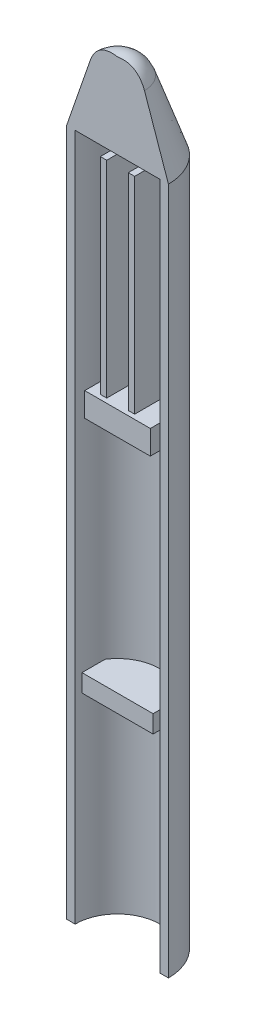
ISO-10303-21;
HEADER;
FILE_DESCRIPTION(('STEP AP214'),'2;1');
FILE_NAME('part.step','',(''),(''),'','','');
FILE_SCHEMA(('AUTOMOTIVE_DESIGN { 1 0 10303 214 1 1 1 1 }'));
ENDSEC;
DATA;
#1=APPLICATION_CONTEXT('core data for automotive mechanical design processes');
#2=APPLICATION_PROTOCOL_DEFINITION('international standard','automotive_design',2000,#1);
#3=PRODUCT_CONTEXT('',#1,'mechanical');
#4=PRODUCT('Part','Part','',(#3));
#5=PRODUCT_RELATED_PRODUCT_CATEGORY('part','',(#4));
#6=PRODUCT_DEFINITION_FORMATION('','',#4);
#7=PRODUCT_DEFINITION_CONTEXT('part definition',#1,'design');
#8=PRODUCT_DEFINITION('design','',#6,#7);
#9=PRODUCT_DEFINITION_SHAPE('','',#8);
#10=(LENGTH_UNIT() NAMED_UNIT(*) SI_UNIT(.MILLI.,.METRE.));
#11=(NAMED_UNIT(*) PLANE_ANGLE_UNIT() SI_UNIT($,.RADIAN.));
#12=(NAMED_UNIT(*) SI_UNIT($,.STERADIAN.) SOLID_ANGLE_UNIT());
#13=UNCERTAINTY_MEASURE_WITH_UNIT(LENGTH_MEASURE(1.E-05),#10,'distance_accuracy_value','');
#14=(GEOMETRIC_REPRESENTATION_CONTEXT(3) GLOBAL_UNCERTAINTY_ASSIGNED_CONTEXT((#13)) GLOBAL_UNIT_ASSIGNED_CONTEXT((#10,
#11,#12)) REPRESENTATION_CONTEXT('',''));
#15=CARTESIAN_POINT('',(0.,0.,0.));
#16=DIRECTION('',(0.,0.,1.));
#17=DIRECTION('',(1.,0.,0.));
#18=AXIS2_PLACEMENT_3D('',#15,#16,#17);
#19=CARTESIAN_POINT('',(0.,91.,0.));
#20=DIRECTION('',(0.,1.,0.));
#21=DIRECTION('',(-1.,0.,0.));
#22=AXIS2_PLACEMENT_3D('',#19,#20,#21);
#23=CYLINDRICAL_SURFACE('',#22,10.);
#24=DIRECTION('',(0.,1.,0.));
#25=VECTOR('',#24,1.);
#26=CARTESIAN_POINT('',(-4.03999999999998,91.,-9.14758984651152));
#27=LINE('',#26,#25);
#28=CARTESIAN_POINT('',(-4.03999999999997,20.0675731061453,-9.14758984651152));
#29=VERTEX_POINT('',#28);
#30=CARTESIAN_POINT('',(-4.03999999999998,68.6220349905325,-9.14758984651151));
#31=VERTEX_POINT('',#30);
#32=EDGE_CURVE('E360',#29,#31,#27,.T.);
#33=ORIENTED_EDGE('',*,*,#32,.T.);
#34=CARTESIAN_POINT('',(0.,68.6220349905325,0.));
#35=DIRECTION('',(0.,1.,0.));
#36=DIRECTION('',(0.,0.,1.));
#37=AXIS2_PLACEMENT_3D('',#34,#35,#36);
#38=CIRCLE('',#37,10.);
#39=CARTESIAN_POINT('',(4.03999999999998,68.6220349905325,-9.1475898465115));
#40=VERTEX_POINT('',#39);
#41=EDGE_CURVE('E330',#40,#31,#38,.T.);
#42=ORIENTED_EDGE('',*,*,#41,.F.);
#43=DIRECTION('',(0.,1.,0.));
#44=VECTOR('',#43,1.);
#45=CARTESIAN_POINT('',(4.03999999999998,91.,-9.14758984651149));
#46=LINE('',#45,#44);
#47=CARTESIAN_POINT('',(4.03999999999998,20.0675731061453,-9.14758984651149));
#48=VERTEX_POINT('',#47);
#49=EDGE_CURVE('E323',#48,#40,#46,.T.);
#50=ORIENTED_EDGE('',*,*,#49,.F.);
#51=CARTESIAN_POINT('',(0.,20.0675731061453,0.));
#52=DIRECTION('',(0.,1.,0.));
#53=DIRECTION('',(0.,0.,1.));
#54=AXIS2_PLACEMENT_3D('',#51,#52,#53);
#55=CIRCLE('',#54,10.);
#56=EDGE_CURVE('E317',#48,#29,#55,.T.);
#57=ORIENTED_EDGE('',*,*,#56,.T.);
#58=EDGE_LOOP('',(#33,#42,#50,#57));
#59=FACE_BOUND('',#58,.T.);
#60=CARTESIAN_POINT('',(0.,13.3474054598744,0.));
#61=DIRECTION('',(0.,-1.,0.));
#62=DIRECTION('',(1.,0.,0.));
#63=AXIS2_PLACEMENT_3D('',#60,#61,#62);
#64=CIRCLE('',#63,10.);
#65=CARTESIAN_POINT('',(-7.72890663595342,13.3474054598744,-6.3453922032224));
#66=VERTEX_POINT('',#65);
#67=CARTESIAN_POINT('',(7.72890663595337,13.3474054598744,-6.34539220322244));
#68=VERTEX_POINT('',#67);
#69=EDGE_CURVE('E280',#66,#68,#64,.T.);
#70=ORIENTED_EDGE('',*,*,#69,.F.);
#71=DIRECTION('',(0.,1.,0.));
#72=VECTOR('',#71,1.);
#73=CARTESIAN_POINT('',(-7.72890663595342,91.,-6.34539220322241));
#74=LINE('',#73,#72);
#75=CARTESIAN_POINT('',(-7.72890663595342,19.,-6.34539220322241));
#76=VERTEX_POINT('',#75);
#77=EDGE_CURVE('E277',#66,#76,#74,.T.);
#78=ORIENTED_EDGE('',*,*,#77,.T.);
#79=CARTESIAN_POINT('',(0.,19.,0.));
#80=DIRECTION('',(0.,-1.,0.));
#81=DIRECTION('',(1.,0.,0.));
#82=AXIS2_PLACEMENT_3D('',#79,#80,#81);
#83=CIRCLE('',#82,10.);
#84=CARTESIAN_POINT('',(7.72890663595337,19.,-6.34539220322242));
#85=VERTEX_POINT('',#84);
#86=EDGE_CURVE('E278',#76,#85,#83,.T.);
#87=ORIENTED_EDGE('',*,*,#86,.T.);
#88=DIRECTION('',(0.,1.,0.));
#89=VECTOR('',#88,1.);
#90=CARTESIAN_POINT('',(7.72890663595335,91.,-6.34539220322244));
#91=LINE('',#90,#89);
#92=EDGE_CURVE('E283',#68,#85,#91,.T.);
#93=ORIENTED_EDGE('',*,*,#92,.F.);
#94=EDGE_LOOP('',(#70,#78,#87,#93));
#95=FACE_BOUND('',#94,.T.);
#96=CARTESIAN_POINT('',(0.,-43.0528382170722,0.));
#97=DIRECTION('',(0.,-1.,0.));
#98=DIRECTION('',(0.,0.,-1.));
#99=AXIS2_PLACEMENT_3D('',#96,#97,#98);
#100=CIRCLE('',#99,10.);
#101=CARTESIAN_POINT('',(-8.38159543616838,-43.0528382170722,-5.45425136424804));
#102=VERTEX_POINT('',#101);
#103=CARTESIAN_POINT('',(8.38159543616822,-43.0528382170722,-5.45425136424825));
#104=VERTEX_POINT('',#103);
#105=EDGE_CURVE('E358',#102,#104,#100,.T.);
#106=ORIENTED_EDGE('',*,*,#105,.F.);
#107=DIRECTION('',(0.,1.,0.));
#108=VECTOR('',#107,1.);
#109=CARTESIAN_POINT('',(-8.38159543616838,91.,-5.45425136424807));
#110=LINE('',#109,#108);
#111=CARTESIAN_POINT('',(-8.38159543616838,-38.8960097043656,-5.45425136424807));
#112=VERTEX_POINT('',#111);
#113=EDGE_CURVE('E318',#102,#112,#110,.T.);
#114=ORIENTED_EDGE('',*,*,#113,.T.);
#115=CARTESIAN_POINT('',(0.,-38.8960097043655,0.));
#116=DIRECTION('',(0.,-1.,0.));
#117=DIRECTION('',(0.,0.,-1.));
#118=AXIS2_PLACEMENT_3D('',#115,#116,#117);
#119=CIRCLE('',#118,10.);
#120=CARTESIAN_POINT('',(8.38159543616822,-38.8960097043655,-5.45425136424827));
#121=VERTEX_POINT('',#120);
#122=EDGE_CURVE('E362',#112,#121,#119,.T.);
#123=ORIENTED_EDGE('',*,*,#122,.T.);
#124=DIRECTION('',(0.,1.,0.));
#125=VECTOR('',#124,1.);
#126=CARTESIAN_POINT('',(8.38159543616822,91.,-5.45425136424825));
#127=LINE('',#126,#125);
#128=EDGE_CURVE('E361',#104,#121,#127,.T.);
#129=ORIENTED_EDGE('',*,*,#128,.F.);
#130=EDGE_LOOP('',(#106,#114,#123,#129));
#131=FACE_BOUND('',#130,.T.);
#132=DIRECTION('',(0.,1.,0.));
#133=VECTOR('',#132,1.);
#134=CARTESIAN_POINT('',(9.99999999999999,91.,0.));
#135=LINE('',#134,#133);
#136=CARTESIAN_POINT('',(9.99999999999999,71.,0.));
#137=VERTEX_POINT('',#136);
#138=CARTESIAN_POINT('',(10.,-91.0399288571137,0.));
#139=VERTEX_POINT('',#138);
#140=EDGE_CURVE('E192',#137,#139,#135,.F.);
#141=ORIENTED_EDGE('',*,*,#140,.F.);
#142=CARTESIAN_POINT('',(0.,71.,0.));
#143=DIRECTION('',(0.,1.,0.));
#144=DIRECTION('',(-1.,0.,0.));
#145=AXIS2_PLACEMENT_3D('',#142,#143,#144);
#146=CIRCLE('',#145,10.);
#147=CARTESIAN_POINT('',(-10.,71.,0.));
#148=VERTEX_POINT('',#147);
#149=EDGE_CURVE('E11',#137,#148,#146,.T.);
#150=ORIENTED_EDGE('',*,*,#149,.T.);
#151=DIRECTION('',(0.,1.,0.));
#152=VECTOR('',#151,1.);
#153=CARTESIAN_POINT('',(-10.,91.,0.));
#154=LINE('',#153,#152);
#155=CARTESIAN_POINT('',(-10.,-91.0399288571137,0.));
#156=VERTEX_POINT('',#155);
#157=EDGE_CURVE('E64',#156,#148,#154,.T.);
#158=ORIENTED_EDGE('',*,*,#157,.F.);
#159=CARTESIAN_POINT('',(0.,-91.0399288571137,0.));
#160=DIRECTION('',(0.,1.,0.));
#161=DIRECTION('',(-1.,0.,0.));
#162=AXIS2_PLACEMENT_3D('',#159,#160,#161);
#163=CIRCLE('',#162,10.);
#164=EDGE_CURVE('E204',#139,#156,#163,.T.);
#165=ORIENTED_EDGE('',*,*,#164,.F.);
#166=EDGE_LOOP('',(#141,#150,#158,#165));
#167=FACE_BOUND('',#166,.T.);
#168=ADVANCED_FACE('F50',(#59,#95,#131,#167),#23,.F.);
#169=CARTESIAN_POINT('',(6.354000148981,87.2790396922268,0.));
#170=CARTESIAN_POINT('',(4.66858918472638,91.7236423414879,0.));
#171=CARTESIAN_POINT('',(0.,91.,0.));
#172=B_SPLINE_CURVE_WITH_KNOTS('',2,(#169,#170,#171),.UNSPECIFIED.,.F.,.F.,(3,3),(0.,1.),.UNSPECIFIED.);
#173=CARTESIAN_POINT('',(0.,91.,0.));
#174=DIRECTION('',(0.,1.,0.));
#175=AXIS1_PLACEMENT('',#173,#174);
#176=SURFACE_OF_REVOLUTION('',#172,#175);
#177=CARTESIAN_POINT('',(6.354000148981,87.2790396922268,0.));
#178=CARTESIAN_POINT('',(4.66858918472638,91.7236423414879,0.));
#179=CARTESIAN_POINT('',(0.,91.,0.));
#180=B_SPLINE_CURVE_WITH_KNOTS('',2,(#177,#178,#179),.UNSPECIFIED.,.F.,.F.,(3,3),(0.,1.),.UNSPECIFIED.);
#181=CARTESIAN_POINT('',(6.354000148981,87.2790396922268,0.));
#182=VERTEX_POINT('',#181);
#183=CARTESIAN_POINT('',(0.,91.,0.));
#184=VERTEX_POINT('',#183);
#185=EDGE_CURVE('E259',#182,#184,#180,.T.);
#186=ORIENTED_EDGE('',*,*,#185,.F.);
#187=CARTESIAN_POINT('',(0.,87.2790396922268,0.));
#188=DIRECTION('',(0.,1.,0.));
#189=DIRECTION('',(-1.,0.,0.));
#190=AXIS2_PLACEMENT_3D('',#187,#188,#189);
#191=CIRCLE('',#190,6.35400014898102);
#192=CARTESIAN_POINT('',(-6.35400014898104,87.2790396922268,0.));
#193=VERTEX_POINT('',#192);
#194=EDGE_CURVE('E60',#182,#193,#191,.T.);
#195=ORIENTED_EDGE('',*,*,#194,.T.);
#196=CARTESIAN_POINT('',(-6.35400014898105,87.2790396922268,0.));
#197=CARTESIAN_POINT('',(-4.66858918472643,91.7236423414879,0.));
#198=CARTESIAN_POINT('',(0.,91.,0.));
#199=B_SPLINE_CURVE_WITH_KNOTS('',2,(#196,#197,#198),.UNSPECIFIED.,.F.,.F.,(3,3),(0.,1.),.UNSPECIFIED.);
#200=EDGE_CURVE('E255',#184,#193,#199,.F.);
#201=ORIENTED_EDGE('',*,*,#200,.F.);
#202=EDGE_LOOP('',(#186,#195,#201));
#203=FACE_BOUND('',#202,.T.);
#204=ADVANCED_FACE('F47',(#203),#176,.T.);
#205=CARTESIAN_POINT('',(0.,71.,0.));
#206=DIRECTION('',(0.,-1.,0.));
#207=DIRECTION('',(1.,0.,0.));
#208=AXIS2_PLACEMENT_3D('',#205,#206,#207);
#209=CONICAL_SURFACE('',#208,12.,0.333844717599232);
#210=DIRECTION('',(-0.327677890106413,-0.944789500542533,0.));
#211=VECTOR('',#210,1.);
#212=CARTESIAN_POINT('',(0.,105.599447655222,0.));
#213=LINE('',#212,#211);
#214=CARTESIAN_POINT('',(-12.,71.,0.));
#215=VERTEX_POINT('',#214);
#216=EDGE_CURVE('E246',#193,#215,#213,.T.);
#217=ORIENTED_EDGE('',*,*,#216,.F.);
#218=ORIENTED_EDGE('',*,*,#194,.F.);
#219=DIRECTION('',(-0.327677890106413,0.944789500542533,0.));
#220=VECTOR('',#219,1.);
#221=CARTESIAN_POINT('',(0.,105.599447655222,0.));
#222=LINE('',#221,#220);
#223=CARTESIAN_POINT('',(12.,71.,0.));
#224=VERTEX_POINT('',#223);
#225=EDGE_CURVE('E254',#224,#182,#222,.T.);
#226=ORIENTED_EDGE('',*,*,#225,.F.);
#227=CARTESIAN_POINT('',(0.,71.,0.));
#228=DIRECTION('',(0.,1.,0.));
#229=DIRECTION('',(-1.,0.,0.));
#230=AXIS2_PLACEMENT_3D('',#227,#228,#229);
#231=CIRCLE('',#230,12.);
#232=EDGE_CURVE('E253',#224,#215,#231,.T.);
#233=ORIENTED_EDGE('',*,*,#232,.T.);
#234=EDGE_LOOP('',(#217,#218,#226,#233));
#235=FACE_BOUND('',#234,.T.);
#236=ADVANCED_FACE('F227',(#235),#209,.T.);
#237=CARTESIAN_POINT('',(0.,91.,0.));
#238=DIRECTION('',(0.,1.,0.));
#239=DIRECTION('',(-1.,0.,0.));
#240=AXIS2_PLACEMENT_3D('',#237,#238,#239);
#241=CYLINDRICAL_SURFACE('',#240,12.);
#242=DIRECTION('',(0.,1.,0.));
#243=VECTOR('',#242,1.);
#244=CARTESIAN_POINT('',(12.,91.,0.));
#245=LINE('',#244,#243);
#246=CARTESIAN_POINT('',(12.,-91.0399288571137,0.));
#247=VERTEX_POINT('',#246);
#248=EDGE_CURVE('E459',#247,#224,#245,.T.);
#249=ORIENTED_EDGE('',*,*,#248,.F.);
#250=CARTESIAN_POINT('',(0.,-91.0399288571137,0.));
#251=DIRECTION('',(0.,1.,0.));
#252=DIRECTION('',(-1.,0.,0.));
#253=AXIS2_PLACEMENT_3D('',#250,#251,#252);
#254=CIRCLE('',#253,12.);
#255=CARTESIAN_POINT('',(-12.,-91.0399288571137,0.));
#256=VERTEX_POINT('',#255);
#257=EDGE_CURVE('E265',#247,#256,#254,.T.);
#258=ORIENTED_EDGE('',*,*,#257,.T.);
#259=DIRECTION('',(0.,1.,0.));
#260=VECTOR('',#259,1.);
#261=CARTESIAN_POINT('',(-12.,91.,0.));
#262=LINE('',#261,#260);
#263=EDGE_CURVE('E465',#215,#256,#262,.F.);
#264=ORIENTED_EDGE('',*,*,#263,.F.);
#265=ORIENTED_EDGE('',*,*,#232,.F.);
#266=EDGE_LOOP('',(#249,#258,#264,#265));
#267=FACE_BOUND('',#266,.T.);
#268=ADVANCED_FACE('F218',(#267),#241,.T.);
#269=CARTESIAN_POINT('',(12.,-91.0399288571137,0.));
#270=DIRECTION('',(0.,1.,0.));
#271=DIRECTION('',(-1.,0.,0.));
#272=AXIS2_PLACEMENT_3D('',#269,#270,#271);
#273=PLANE('',#272);
#274=DIRECTION('',(1.,0.,0.));
#275=VECTOR('',#274,1.);
#276=CARTESIAN_POINT('',(12.,-91.0399288571137,0.));
#277=LINE('',#276,#275);
#278=EDGE_CURVE('E462',#256,#156,#277,.T.);
#279=ORIENTED_EDGE('',*,*,#278,.F.);
#280=ORIENTED_EDGE('',*,*,#257,.F.);
#281=EDGE_CURVE('E206',#139,#247,#277,.T.);
#282=ORIENTED_EDGE('',*,*,#281,.F.);
#283=ORIENTED_EDGE('',*,*,#164,.T.);
#284=EDGE_LOOP('',(#279,#280,#282,#283));
#285=FACE_BOUND('',#284,.T.);
#286=ADVANCED_FACE('F211',(#285),#273,.F.);
#287=CARTESIAN_POINT('',(12.,71.,0.));
#288=DIRECTION('',(0.,1.,0.));
#289=DIRECTION('',(-1.,0.,0.));
#290=AXIS2_PLACEMENT_3D('',#287,#288,#289);
#291=PLANE('',#290);
#292=DIRECTION('',(1.,0.,0.));
#293=VECTOR('',#292,1.);
#294=CARTESIAN_POINT('',(12.,71.,0.));
#295=LINE('',#294,#293);
#296=EDGE_CURVE('E191',#148,#137,#295,.T.);
#297=ORIENTED_EDGE('',*,*,#296,.F.);
#298=ORIENTED_EDGE('',*,*,#149,.F.);
#299=EDGE_LOOP('',(#297,#298));
#300=FACE_BOUND('',#299,.T.);
#301=ADVANCED_FACE('F208',(#300),#291,.F.);
#302=CARTESIAN_POINT('',(-2.53999999999998,0.,-12.002));
#303=DIRECTION('',(1.,0.,0.));
#304=DIRECTION('',(0.,0.,-1.));
#305=AXIS2_PLACEMENT_3D('',#302,#303,#304);
#306=PLANE('',#305);
#307=DIRECTION('',(0.,0.,1.));
#308=VECTOR('',#307,1.);
#309=CARTESIAN_POINT('',(-2.53999999999998,20.0675731061453,-12.002));
#310=LINE('',#309,#308);
#311=CARTESIAN_POINT('',(-2.53999999999998,20.0675731061453,-9.5));
#312=VERTEX_POINT('',#311);
#313=CARTESIAN_POINT('',(-2.53999999999998,20.0675731061453,0.));
#314=VERTEX_POINT('',#313);
#315=EDGE_CURVE('E75',#312,#314,#310,.T.);
#316=ORIENTED_EDGE('',*,*,#315,.F.);
#317=DIRECTION('',(0.,1.,0.));
#318=VECTOR('',#317,1.);
#319=CARTESIAN_POINT('',(-2.53999999999998,0.,-9.5));
#320=LINE('',#319,#318);
#321=CARTESIAN_POINT('',(-2.53999999999998,68.6220349905325,-9.5));
#322=VERTEX_POINT('',#321);
#323=EDGE_CURVE('E428',#312,#322,#320,.T.);
#324=ORIENTED_EDGE('',*,*,#323,.T.);
#325=DIRECTION('',(0.,0.,1.));
#326=VECTOR('',#325,1.);
#327=CARTESIAN_POINT('',(-2.53999999999998,68.6220349905325,-12.002));
#328=LINE('',#327,#326);
#329=CARTESIAN_POINT('',(-2.53999999999998,68.6220349905325,0.));
#330=VERTEX_POINT('',#329);
#331=EDGE_CURVE('E408',#322,#330,#328,.T.);
#332=ORIENTED_EDGE('',*,*,#331,.T.);
#333=DIRECTION('',(0.,1.,0.));
#334=VECTOR('',#333,1.);
#335=CARTESIAN_POINT('',(-2.53999999999998,0.,0.));
#336=LINE('',#335,#334);
#337=EDGE_CURVE('E418',#314,#330,#336,.T.);
#338=ORIENTED_EDGE('',*,*,#337,.F.);
#339=EDGE_LOOP('',(#316,#324,#332,#338));
#340=FACE_BOUND('',#339,.T.);
#341=ADVANCED_FACE('F209',(#340),#306,.T.);
#342=CARTESIAN_POINT('',(2.53999999999998,0.,-12.002));
#343=DIRECTION('',(1.,0.,0.));
#344=DIRECTION('',(0.,0.,-1.));
#345=AXIS2_PLACEMENT_3D('',#342,#343,#344);
#346=PLANE('',#345);
#347=DIRECTION('',(0.,1.,0.));
#348=VECTOR('',#347,1.);
#349=CARTESIAN_POINT('',(2.53999999999998,0.,-9.5));
#350=LINE('',#349,#348);
#351=CARTESIAN_POINT('',(2.53999999999998,20.0675731061453,-9.5));
#352=VERTEX_POINT('',#351);
#353=CARTESIAN_POINT('',(2.53999999999998,68.6220349905325,-9.5));
#354=VERTEX_POINT('',#353);
#355=EDGE_CURVE('E434',#352,#354,#350,.T.);
#356=ORIENTED_EDGE('',*,*,#355,.F.);
#357=DIRECTION('',(0.,0.,1.));
#358=VECTOR('',#357,1.);
#359=CARTESIAN_POINT('',(2.53999999999998,20.0675731061453,-12.002));
#360=LINE('',#359,#358);
#361=CARTESIAN_POINT('',(2.53999999999998,20.0675731061453,0.));
#362=VERTEX_POINT('',#361);
#363=EDGE_CURVE('E329',#352,#362,#360,.T.);
#364=ORIENTED_EDGE('',*,*,#363,.T.);
#365=DIRECTION('',(0.,1.,0.));
#366=VECTOR('',#365,1.);
#367=CARTESIAN_POINT('',(2.53999999999998,0.,0.));
#368=LINE('',#367,#366);
#369=CARTESIAN_POINT('',(2.53999999999998,68.6220349905325,0.));
#370=VERTEX_POINT('',#369);
#371=EDGE_CURVE('E354',#362,#370,#368,.T.);
#372=ORIENTED_EDGE('',*,*,#371,.T.);
#373=DIRECTION('',(0.,0.,1.));
#374=VECTOR('',#373,1.);
#375=CARTESIAN_POINT('',(2.53999999999998,68.6220349905325,-12.002));
#376=LINE('',#375,#374);
#377=EDGE_CURVE('E339',#354,#370,#376,.T.);
#378=ORIENTED_EDGE('',*,*,#377,.F.);
#379=EDGE_LOOP('',(#356,#364,#372,#378));
#380=FACE_BOUND('',#379,.T.);
#381=ADVANCED_FACE('F220',(#380),#346,.F.);
#382=CARTESIAN_POINT('',(7.72890663595338,0.,-12.002));
#383=DIRECTION('',(1.,0.,0.));
#384=DIRECTION('',(0.,1.,0.));
#385=AXIS2_PLACEMENT_3D('',#382,#383,#384);
#386=PLANE('',#385);
#387=DIRECTION('',(0.,0.,1.));
#388=VECTOR('',#387,1.);
#389=CARTESIAN_POINT('',(7.72890663595337,13.3474054598744,-12.002));
#390=LINE('',#389,#388);
#391=CARTESIAN_POINT('',(7.72890663595337,13.3474054598744,0.));
#392=VERTEX_POINT('',#391);
#393=EDGE_CURVE('E284',#68,#392,#390,.T.);
#394=ORIENTED_EDGE('',*,*,#393,.F.);
#395=ORIENTED_EDGE('',*,*,#92,.T.);
#396=DIRECTION('',(0.,0.,1.));
#397=VECTOR('',#396,1.);
#398=CARTESIAN_POINT('',(7.72890663595337,19.,-12.002));
#399=LINE('',#398,#397);
#400=CARTESIAN_POINT('',(7.72890663595337,19.,0.));
#401=VERTEX_POINT('',#400);
#402=EDGE_CURVE('E291',#85,#401,#399,.T.);
#403=ORIENTED_EDGE('',*,*,#402,.T.);
#404=DIRECTION('',(0.,1.,0.));
#405=VECTOR('',#404,1.);
#406=CARTESIAN_POINT('',(7.72890663595338,0.,0.));
#407=LINE('',#406,#405);
#408=EDGE_CURVE('E309',#392,#401,#407,.T.);
#409=ORIENTED_EDGE('',*,*,#408,.F.);
#410=EDGE_LOOP('',(#394,#395,#403,#409));
#411=FACE_BOUND('',#410,.T.);
#412=ADVANCED_FACE('F511',(#411),#386,.T.);
#413=CARTESIAN_POINT('',(0.,19.,-12.002));
#414=DIRECTION('',(0.,-1.,0.));
#415=DIRECTION('',(1.,0.,0.));
#416=AXIS2_PLACEMENT_3D('',#413,#414,#415);
#417=PLANE('',#416);
#418=ORIENTED_EDGE('',*,*,#86,.F.);
#419=DIRECTION('',(0.,0.,1.));
#420=VECTOR('',#419,1.);
#421=CARTESIAN_POINT('',(-7.72890663595342,19.,-12.002));
#422=LINE('',#421,#420);
#423=CARTESIAN_POINT('',(-7.72890663595342,19.,0.));
#424=VERTEX_POINT('',#423);
#425=EDGE_CURVE('E298',#76,#424,#422,.T.);
#426=ORIENTED_EDGE('',*,*,#425,.T.);
#427=DIRECTION('',(1.,0.,0.));
#428=VECTOR('',#427,1.);
#429=CARTESIAN_POINT('',(0.,19.,0.));
#430=LINE('',#429,#428);
#431=EDGE_CURVE('E308',#424,#401,#430,.T.);
#432=ORIENTED_EDGE('',*,*,#431,.T.);
#433=ORIENTED_EDGE('',*,*,#402,.F.);
#434=EDGE_LOOP('',(#418,#426,#432,#433));
#435=FACE_BOUND('',#434,.T.);
#436=ADVANCED_FACE('F538',(#435),#417,.F.);
#437=CARTESIAN_POINT('',(0.,0.,0.));
#438=DIRECTION('',(0.,0.,1.));
#439=DIRECTION('',(1.,0.,0.));
#440=AXIS2_PLACEMENT_3D('',#437,#438,#439);
#441=PLANE('',#440);
#442=DIRECTION('',(1.,0.,0.));
#443=VECTOR('',#442,1.);
#444=CARTESIAN_POINT('',(0.,13.3474054598744,0.));
#445=LINE('',#444,#443);
#446=CARTESIAN_POINT('',(-7.72890663595342,13.3474054598744,0.));
#447=VERTEX_POINT('',#446);
#448=EDGE_CURVE('E314',#447,#392,#445,.T.);
#449=ORIENTED_EDGE('',*,*,#448,.T.);
#450=ORIENTED_EDGE('',*,*,#408,.T.);
#451=ORIENTED_EDGE('',*,*,#431,.F.);
#452=DIRECTION('',(0.,1.,0.));
#453=VECTOR('',#452,1.);
#454=CARTESIAN_POINT('',(-7.72890663595342,0.,0.));
#455=LINE('',#454,#453);
#456=EDGE_CURVE('E301',#447,#424,#455,.T.);
#457=ORIENTED_EDGE('',*,*,#456,.F.);
#458=EDGE_LOOP('',(#449,#450,#451,#457));
#459=FACE_BOUND('',#458,.T.);
#460=ADVANCED_FACE('F536',(#459),#441,.T.);
#461=CARTESIAN_POINT('',(0.,13.3474054598744,-12.002));
#462=DIRECTION('',(0.,-1.,0.));
#463=DIRECTION('',(1.,0.,0.));
#464=AXIS2_PLACEMENT_3D('',#461,#462,#463);
#465=PLANE('',#464);
#466=DIRECTION('',(0.,0.,1.));
#467=VECTOR('',#466,1.);
#468=CARTESIAN_POINT('',(-7.72890663595342,13.3474054598744,-12.002));
#469=LINE('',#468,#467);
#470=EDGE_CURVE('E299',#66,#447,#469,.T.);
#471=ORIENTED_EDGE('',*,*,#470,.F.);
#472=ORIENTED_EDGE('',*,*,#69,.T.);
#473=ORIENTED_EDGE('',*,*,#393,.T.);
#474=ORIENTED_EDGE('',*,*,#448,.F.);
#475=EDGE_LOOP('',(#471,#472,#473,#474));
#476=FACE_BOUND('',#475,.T.);
#477=ADVANCED_FACE('F232',(#476),#465,.T.);
#478=CARTESIAN_POINT('',(-7.72890663595342,0.,-12.002));
#479=DIRECTION('',(1.,0.,0.));
#480=DIRECTION('',(0.,0.,-1.));
#481=AXIS2_PLACEMENT_3D('',#478,#479,#480);
#482=PLANE('',#481);
#483=ORIENTED_EDGE('',*,*,#77,.F.);
#484=ORIENTED_EDGE('',*,*,#470,.T.);
#485=ORIENTED_EDGE('',*,*,#456,.T.);
#486=ORIENTED_EDGE('',*,*,#425,.F.);
#487=EDGE_LOOP('',(#483,#484,#485,#486));
#488=FACE_BOUND('',#487,.T.);
#489=ADVANCED_FACE('F509',(#488),#482,.F.);
#490=CARTESIAN_POINT('',(0.,0.,0.));
#491=DIRECTION('',(0.,0.,1.));
#492=DIRECTION('',(1.,0.,0.));
#493=AXIS2_PLACEMENT_3D('',#490,#491,#492);
#494=PLANE('',#493);
#495=DIRECTION('',(0.,1.,0.));
#496=VECTOR('',#495,1.);
#497=CARTESIAN_POINT('',(-4.03999999999998,0.,0.));
#498=LINE('',#497,#496);
#499=CARTESIAN_POINT('',(-4.03999999999998,20.0675731061453,0.));
#500=VERTEX_POINT('',#499);
#501=CARTESIAN_POINT('',(-4.03999999999998,68.6220349905325,0.));
#502=VERTEX_POINT('',#501);
#503=EDGE_CURVE('E424',#500,#502,#498,.T.);
#504=ORIENTED_EDGE('',*,*,#503,.F.);
#505=DIRECTION('',(1.,0.,0.));
#506=VECTOR('',#505,1.);
#507=CARTESIAN_POINT('',(0.,20.0675731061453,0.));
#508=LINE('',#507,#506);
#509=EDGE_CURVE('E419',#500,#314,#508,.T.);
#510=ORIENTED_EDGE('',*,*,#509,.T.);
#511=ORIENTED_EDGE('',*,*,#337,.T.);
#512=DIRECTION('',(1.,0.,0.));
#513=VECTOR('',#512,1.);
#514=CARTESIAN_POINT('',(0.,68.6220349905325,0.));
#515=LINE('',#514,#513);
#516=EDGE_CURVE('E411',#502,#330,#515,.T.);
#517=ORIENTED_EDGE('',*,*,#516,.F.);
#518=EDGE_LOOP('',(#504,#510,#511,#517));
#519=FACE_BOUND('',#518,.T.);
#520=ADVANCED_FACE('F501',(#519),#494,.T.);
#521=CARTESIAN_POINT('',(-4.03999999999998,0.,-12.002));
#522=DIRECTION('',(1.,0.,0.));
#523=DIRECTION('',(0.,0.,-1.));
#524=AXIS2_PLACEMENT_3D('',#521,#522,#523);
#525=PLANE('',#524);
#526=ORIENTED_EDGE('',*,*,#32,.F.);
#527=DIRECTION('',(0.,0.,1.));
#528=VECTOR('',#527,1.);
#529=CARTESIAN_POINT('',(-4.03999999999998,20.0675731061453,-12.002));
#530=LINE('',#529,#528);
#531=EDGE_CURVE('E402',#29,#500,#530,.T.);
#532=ORIENTED_EDGE('',*,*,#531,.T.);
#533=ORIENTED_EDGE('',*,*,#503,.T.);
#534=DIRECTION('',(0.,0.,1.));
#535=VECTOR('',#534,1.);
#536=CARTESIAN_POINT('',(-4.03999999999998,68.6220349905325,-12.002));
#537=LINE('',#536,#535);
#538=EDGE_CURVE('E409',#31,#502,#537,.T.);
#539=ORIENTED_EDGE('',*,*,#538,.F.);
#540=EDGE_LOOP('',(#526,#532,#533,#539));
#541=FACE_BOUND('',#540,.T.);
#542=ADVANCED_FACE('F496',(#541),#525,.F.);
#543=CARTESIAN_POINT('',(0.,20.0675731061453,-12.002));
#544=DIRECTION('',(0.,1.,0.));
#545=DIRECTION('',(0.,0.,1.));
#546=AXIS2_PLACEMENT_3D('',#543,#544,#545);
#547=PLANE('',#546);
#548=ORIENTED_EDGE('',*,*,#56,.F.);
#549=DIRECTION('',(0.,0.,1.));
#550=VECTOR('',#549,1.);
#551=CARTESIAN_POINT('',(4.03999999999998,20.0675731061453,-12.002));
#552=LINE('',#551,#550);
#553=CARTESIAN_POINT('',(4.03999999999998,20.0675731061453,0.));
#554=VERTEX_POINT('',#553);
#555=EDGE_CURVE('E334',#48,#554,#552,.T.);
#556=ORIENTED_EDGE('',*,*,#555,.T.);
#557=DIRECTION('',(-1.,0.,0.));
#558=VECTOR('',#557,1.);
#559=CARTESIAN_POINT('',(0.,20.0675731061453,0.));
#560=LINE('',#559,#558);
#561=EDGE_CURVE('E348',#554,#362,#560,.T.);
#562=ORIENTED_EDGE('',*,*,#561,.T.);
#563=ORIENTED_EDGE('',*,*,#363,.F.);
#564=DIRECTION('',(1.,0.,0.));
#565=VECTOR('',#564,1.);
#566=CARTESIAN_POINT('',(0.,20.0675731061453,-9.5));
#567=LINE('',#566,#565);
#568=EDGE_CURVE('E431',#312,#352,#567,.T.);
#569=ORIENTED_EDGE('',*,*,#568,.F.);
#570=ORIENTED_EDGE('',*,*,#315,.T.);
#571=ORIENTED_EDGE('',*,*,#509,.F.);
#572=ORIENTED_EDGE('',*,*,#531,.F.);
#573=EDGE_LOOP('',(#548,#556,#562,#563,#569,#570,#571,#572));
#574=FACE_BOUND('',#573,.T.);
#575=ADVANCED_FACE('F482',(#574),#547,.F.);
#576=CARTESIAN_POINT('',(0.,0.,0.));
#577=DIRECTION('',(0.,0.,1.));
#578=DIRECTION('',(1.,0.,0.));
#579=AXIS2_PLACEMENT_3D('',#576,#577,#578);
#580=PLANE('',#579);
#581=ORIENTED_EDGE('',*,*,#371,.F.);
#582=ORIENTED_EDGE('',*,*,#561,.F.);
#583=DIRECTION('',(0.,1.,0.));
#584=VECTOR('',#583,1.);
#585=CARTESIAN_POINT('',(4.03999999999998,0.,0.));
#586=LINE('',#585,#584);
#587=CARTESIAN_POINT('',(4.03999999999998,68.6220349905325,0.));
#588=VERTEX_POINT('',#587);
#589=EDGE_CURVE('E347',#554,#588,#586,.T.);
#590=ORIENTED_EDGE('',*,*,#589,.T.);
#591=DIRECTION('',(-1.,0.,0.));
#592=VECTOR('',#591,1.);
#593=CARTESIAN_POINT('',(0.,68.6220349905325,0.));
#594=LINE('',#593,#592);
#595=EDGE_CURVE('E341',#588,#370,#594,.T.);
#596=ORIENTED_EDGE('',*,*,#595,.T.);
#597=EDGE_LOOP('',(#581,#582,#590,#596));
#598=FACE_BOUND('',#597,.T.);
#599=ADVANCED_FACE('F489',(#598),#580,.T.);
#600=CARTESIAN_POINT('',(4.03999999999998,0.,-12.002));
#601=DIRECTION('',(1.,0.,0.));
#602=DIRECTION('',(0.,0.,-1.));
#603=AXIS2_PLACEMENT_3D('',#600,#601,#602);
#604=PLANE('',#603);
#605=ORIENTED_EDGE('',*,*,#555,.F.);
#606=ORIENTED_EDGE('',*,*,#49,.T.);
#607=DIRECTION('',(0.,0.,1.));
#608=VECTOR('',#607,1.);
#609=CARTESIAN_POINT('',(4.03999999999998,68.6220349905325,-12.002));
#610=LINE('',#609,#608);
#611=EDGE_CURVE('E338',#40,#588,#610,.T.);
#612=ORIENTED_EDGE('',*,*,#611,.T.);
#613=ORIENTED_EDGE('',*,*,#589,.F.);
#614=EDGE_LOOP('',(#605,#606,#612,#613));
#615=FACE_BOUND('',#614,.T.);
#616=ADVANCED_FACE('F493',(#615),#604,.T.);
#617=CARTESIAN_POINT('',(0.,68.6220349905325,-12.002));
#618=DIRECTION('',(0.,1.,0.));
#619=DIRECTION('',(0.,0.,1.));
#620=AXIS2_PLACEMENT_3D('',#617,#618,#619);
#621=PLANE('',#620);
#622=ORIENTED_EDGE('',*,*,#611,.F.);
#623=ORIENTED_EDGE('',*,*,#41,.T.);
#624=ORIENTED_EDGE('',*,*,#538,.T.);
#625=ORIENTED_EDGE('',*,*,#516,.T.);
#626=ORIENTED_EDGE('',*,*,#331,.F.);
#627=DIRECTION('',(1.,0.,0.));
#628=VECTOR('',#627,1.);
#629=CARTESIAN_POINT('',(0.,68.6220349905325,-9.5));
#630=LINE('',#629,#628);
#631=EDGE_CURVE('E438',#322,#354,#630,.T.);
#632=ORIENTED_EDGE('',*,*,#631,.T.);
#633=ORIENTED_EDGE('',*,*,#377,.T.);
#634=ORIENTED_EDGE('',*,*,#595,.F.);
#635=EDGE_LOOP('',(#622,#623,#624,#625,#626,#632,#633,#634));
#636=FACE_BOUND('',#635,.T.);
#637=ADVANCED_FACE('F478',(#636),#621,.T.);
#638=CARTESIAN_POINT('',(8.38159543616822,0.,-12.002));
#639=DIRECTION('',(1.,0.,0.));
#640=DIRECTION('',(0.,0.,-1.));
#641=AXIS2_PLACEMENT_3D('',#638,#639,#640);
#642=PLANE('',#641);
#643=DIRECTION('',(0.,0.,1.));
#644=VECTOR('',#643,1.);
#645=CARTESIAN_POINT('',(8.38159543616822,-43.0528382170722,-12.002));
#646=LINE('',#645,#644);
#647=CARTESIAN_POINT('',(8.38159543616822,-43.0528382170722,0.));
#648=VERTEX_POINT('',#647);
#649=EDGE_CURVE('E368',#104,#648,#646,.T.);
#650=ORIENTED_EDGE('',*,*,#649,.F.);
#651=ORIENTED_EDGE('',*,*,#128,.T.);
#652=DIRECTION('',(0.,0.,1.));
#653=VECTOR('',#652,1.);
#654=CARTESIAN_POINT('',(8.38159543616822,-38.8960097043656,-12.002));
#655=LINE('',#654,#653);
#656=CARTESIAN_POINT('',(8.38159543616822,-38.8960097043656,0.));
#657=VERTEX_POINT('',#656);
#658=EDGE_CURVE('E374',#121,#657,#655,.T.);
#659=ORIENTED_EDGE('',*,*,#658,.T.);
#660=DIRECTION('',(0.,1.,0.));
#661=VECTOR('',#660,1.);
#662=CARTESIAN_POINT('',(8.38159543616822,0.,0.));
#663=LINE('',#662,#661);
#664=EDGE_CURVE('E395',#648,#657,#663,.T.);
#665=ORIENTED_EDGE('',*,*,#664,.F.);
#666=EDGE_LOOP('',(#650,#651,#659,#665));
#667=FACE_BOUND('',#666,.T.);
#668=ADVANCED_FACE('F516',(#667),#642,.T.);
#669=CARTESIAN_POINT('',(0.,-38.8960097043656,-12.002));
#670=DIRECTION('',(0.,-1.,0.));
#671=DIRECTION('',(0.,0.,-1.));
#672=AXIS2_PLACEMENT_3D('',#669,#670,#671);
#673=PLANE('',#672);
#674=ORIENTED_EDGE('',*,*,#122,.F.);
#675=DIRECTION('',(0.,0.,1.));
#676=VECTOR('',#675,1.);
#677=CARTESIAN_POINT('',(-8.38159543616838,-38.8960097043656,-12.002));
#678=LINE('',#677,#676);
#679=CARTESIAN_POINT('',(-8.38159543616838,-38.8960097043656,0.));
#680=VERTEX_POINT('',#679);
#681=EDGE_CURVE('E378',#112,#680,#678,.T.);
#682=ORIENTED_EDGE('',*,*,#681,.T.);
#683=DIRECTION('',(1.,0.,0.));
#684=VECTOR('',#683,1.);
#685=CARTESIAN_POINT('',(0.,-38.8960097043656,0.));
#686=LINE('',#685,#684);
#687=EDGE_CURVE('E389',#680,#657,#686,.T.);
#688=ORIENTED_EDGE('',*,*,#687,.T.);
#689=ORIENTED_EDGE('',*,*,#658,.F.);
#690=EDGE_LOOP('',(#674,#682,#688,#689));
#691=FACE_BOUND('',#690,.T.);
#692=ADVANCED_FACE('F523',(#691),#673,.F.);
#693=CARTESIAN_POINT('',(0.,0.,0.));
#694=DIRECTION('',(0.,0.,1.));
#695=DIRECTION('',(1.,0.,0.));
#696=AXIS2_PLACEMENT_3D('',#693,#694,#695);
#697=PLANE('',#696);
#698=DIRECTION('',(1.,0.,0.));
#699=VECTOR('',#698,1.);
#700=CARTESIAN_POINT('',(0.,-43.0528382170722,0.));
#701=LINE('',#700,#699);
#702=CARTESIAN_POINT('',(-8.38159543616838,-43.0528382170722,0.));
#703=VERTEX_POINT('',#702);
#704=EDGE_CURVE('E325',#703,#648,#701,.T.);
#705=ORIENTED_EDGE('',*,*,#704,.T.);
#706=ORIENTED_EDGE('',*,*,#664,.T.);
#707=ORIENTED_EDGE('',*,*,#687,.F.);
#708=DIRECTION('',(0.,1.,0.));
#709=VECTOR('',#708,1.);
#710=CARTESIAN_POINT('',(-8.38159543616838,0.,0.));
#711=LINE('',#710,#709);
#712=EDGE_CURVE('E383',#703,#680,#711,.T.);
#713=ORIENTED_EDGE('',*,*,#712,.F.);
#714=EDGE_LOOP('',(#705,#706,#707,#713));
#715=FACE_BOUND('',#714,.T.);
#716=ADVANCED_FACE('F628',(#715),#697,.T.);
#717=CARTESIAN_POINT('',(0.,-43.0528382170722,-12.002));
#718=DIRECTION('',(0.,-1.,0.));
#719=DIRECTION('',(0.,0.,-1.));
#720=AXIS2_PLACEMENT_3D('',#717,#718,#719);
#721=PLANE('',#720);
#722=DIRECTION('',(0.,0.,1.));
#723=VECTOR('',#722,1.);
#724=CARTESIAN_POINT('',(-8.38159543616838,-43.0528382170722,-12.002));
#725=LINE('',#724,#723);
#726=EDGE_CURVE('E381',#102,#703,#725,.T.);
#727=ORIENTED_EDGE('',*,*,#726,.F.);
#728=ORIENTED_EDGE('',*,*,#105,.T.);
#729=ORIENTED_EDGE('',*,*,#649,.T.);
#730=ORIENTED_EDGE('',*,*,#704,.F.);
#731=EDGE_LOOP('',(#727,#728,#729,#730));
#732=FACE_BOUND('',#731,.T.);
#733=ADVANCED_FACE('F638',(#732),#721,.T.);
#734=CARTESIAN_POINT('',(-8.38159543616838,0.,-12.002));
#735=DIRECTION('',(1.,0.,0.));
#736=DIRECTION('',(0.,0.,-1.));
#737=AXIS2_PLACEMENT_3D('',#734,#735,#736);
#738=PLANE('',#737);
#739=ORIENTED_EDGE('',*,*,#113,.F.);
#740=ORIENTED_EDGE('',*,*,#726,.T.);
#741=ORIENTED_EDGE('',*,*,#712,.T.);
#742=ORIENTED_EDGE('',*,*,#681,.F.);
#743=EDGE_LOOP('',(#739,#740,#741,#742));
#744=FACE_BOUND('',#743,.T.);
#745=ADVANCED_FACE('F531',(#744),#738,.F.);
#746=CARTESIAN_POINT('',(0.,0.,-9.5));
#747=DIRECTION('',(0.,0.,1.));
#748=DIRECTION('',(1.,0.,0.));
#749=AXIS2_PLACEMENT_3D('',#746,#747,#748);
#750=PLANE('',#749);
#751=ORIENTED_EDGE('',*,*,#323,.F.);
#752=ORIENTED_EDGE('',*,*,#568,.T.);
#753=ORIENTED_EDGE('',*,*,#355,.T.);
#754=ORIENTED_EDGE('',*,*,#631,.F.);
#755=EDGE_LOOP('',(#751,#752,#753,#754));
#756=FACE_BOUND('',#755,.T.);
#757=ADVANCED_FACE('F477',(#756),#750,.T.);
#758=CARTESIAN_POINT('',(0.,0.,0.));
#759=DIRECTION('',(0.,0.,1.));
#760=DIRECTION('',(1.,0.,0.));
#761=AXIS2_PLACEMENT_3D('',#758,#759,#760);
#762=PLANE('',#761);
#763=ORIENTED_EDGE('',*,*,#185,.T.);
#764=ORIENTED_EDGE('',*,*,#200,.T.);
#765=ORIENTED_EDGE('',*,*,#216,.T.);
#766=ORIENTED_EDGE('',*,*,#263,.T.);
#767=ORIENTED_EDGE('',*,*,#278,.T.);
#768=ORIENTED_EDGE('',*,*,#157,.T.);
#769=ORIENTED_EDGE('',*,*,#296,.T.);
#770=ORIENTED_EDGE('',*,*,#140,.T.);
#771=ORIENTED_EDGE('',*,*,#281,.T.);
#772=ORIENTED_EDGE('',*,*,#248,.T.);
#773=ORIENTED_EDGE('',*,*,#225,.T.);
#774=EDGE_LOOP('',(#763,#764,#765,#766,#767,#768,#769,#770,#771,#772,#773));
#775=FACE_BOUND('',#774,.T.);
#776=ADVANCED_FACE('F193',(#775),#762,.T.);
#777=CLOSED_SHELL('',(#168,#204,#236,#268,#286,#301,#341,#381,#412,#436,#460,#477,#489,#520,
#542,#575,#599,#616,#637,#668,#692,#716,#733,#745,#757,#776));
#778=MANIFOLD_SOLID_BREP('B2',#777);
#779=ADVANCED_BREP_SHAPE_REPRESENTATION('',(#18,#778),#14);
#780=SHAPE_DEFINITION_REPRESENTATION(#9,#779);
ENDSEC;
END-ISO-10303-21;
